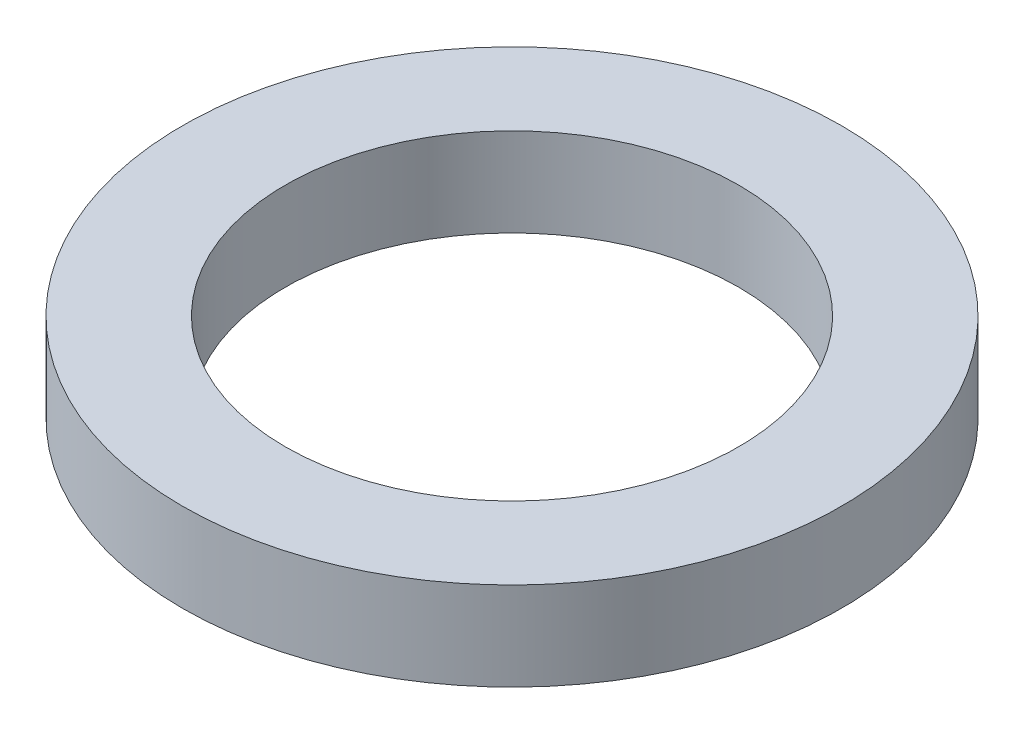
ISO-10303-21;
HEADER;
FILE_DESCRIPTION(('STEP AP214'),'2;1');
FILE_NAME('part.step','',(''),(''),'','','');
FILE_SCHEMA(('AUTOMOTIVE_DESIGN { 1 0 10303 214 1 1 1 1 }'));
ENDSEC;
DATA;
#1=APPLICATION_CONTEXT('core data for automotive mechanical design processes');
#2=APPLICATION_PROTOCOL_DEFINITION('international standard','automotive_design',2000,#1);
#3=PRODUCT_CONTEXT('',#1,'mechanical');
#4=PRODUCT('Part','Part','',(#3));
#5=PRODUCT_RELATED_PRODUCT_CATEGORY('part','',(#4));
#6=PRODUCT_DEFINITION_FORMATION('','',#4);
#7=PRODUCT_DEFINITION_CONTEXT('part definition',#1,'design');
#8=PRODUCT_DEFINITION('design','',#6,#7);
#9=PRODUCT_DEFINITION_SHAPE('','',#8);
#10=(LENGTH_UNIT() NAMED_UNIT(*) SI_UNIT(.MILLI.,.METRE.));
#11=(NAMED_UNIT(*) PLANE_ANGLE_UNIT() SI_UNIT($,.RADIAN.));
#12=(NAMED_UNIT(*) SI_UNIT($,.STERADIAN.) SOLID_ANGLE_UNIT());
#13=UNCERTAINTY_MEASURE_WITH_UNIT(LENGTH_MEASURE(1.E-05),#10,'distance_accuracy_value','');
#14=(GEOMETRIC_REPRESENTATION_CONTEXT(3) GLOBAL_UNCERTAINTY_ASSIGNED_CONTEXT((#13)) GLOBAL_UNIT_ASSIGNED_CONTEXT((#10,
#11,#12)) REPRESENTATION_CONTEXT('',''));
#15=CARTESIAN_POINT('',(0.,0.,0.));
#16=DIRECTION('',(0.,0.,1.));
#17=DIRECTION('',(1.,0.,0.));
#18=AXIS2_PLACEMENT_3D('',#15,#16,#17);
#19=CARTESIAN_POINT('',(0.,2.,0.));
#20=DIRECTION('',(0.,1.,0.));
#21=DIRECTION('',(0.,0.,1.));
#22=AXIS2_PLACEMENT_3D('',#19,#20,#21);
#23=PLANE('',#22);
#24=CARTESIAN_POINT('',(0.,2.,0.));
#25=DIRECTION('',(0.,1.,0.));
#26=DIRECTION('',(0.,0.,1.));
#27=AXIS2_PLACEMENT_3D('',#24,#25,#26);
#28=CIRCLE('',#27,7.45);
#29=CARTESIAN_POINT('',(0.,2.,7.45));
#30=VERTEX_POINT('',#29);
#31=EDGE_CURVE('E10',#30,#30,#28,.T.);
#32=ORIENTED_EDGE('',*,*,#31,.T.);
#33=EDGE_LOOP('',(#32));
#34=FACE_BOUND('',#33,.T.);
#35=CARTESIAN_POINT('',(0.,2.,0.));
#36=DIRECTION('',(0.,1.,0.));
#37=DIRECTION('',(0.,0.,1.));
#38=AXIS2_PLACEMENT_3D('',#35,#36,#37);
#39=CIRCLE('',#38,5.125);
#40=CARTESIAN_POINT('',(0.,2.,5.125));
#41=VERTEX_POINT('',#40);
#42=EDGE_CURVE('E54',#41,#41,#39,.T.);
#43=ORIENTED_EDGE('',*,*,#42,.F.);
#44=EDGE_LOOP('',(#43));
#45=FACE_BOUND('',#44,.T.);
#46=ADVANCED_FACE('F41',(#34,#45),#23,.T.);
#47=CARTESIAN_POINT('',(0.,0.,0.));
#48=DIRECTION('',(0.,1.,0.));
#49=DIRECTION('',(0.,0.,1.));
#50=AXIS2_PLACEMENT_3D('',#47,#48,#49);
#51=PLANE('',#50);
#52=CARTESIAN_POINT('',(0.,0.,0.));
#53=DIRECTION('',(0.,1.,0.));
#54=DIRECTION('',(0.,0.,1.));
#55=AXIS2_PLACEMENT_3D('',#52,#53,#54);
#56=CIRCLE('',#55,7.45);
#57=CARTESIAN_POINT('',(0.,0.,7.45));
#58=VERTEX_POINT('',#57);
#59=EDGE_CURVE('E45',#58,#58,#56,.T.);
#60=ORIENTED_EDGE('',*,*,#59,.F.);
#61=EDGE_LOOP('',(#60));
#62=FACE_BOUND('',#61,.T.);
#63=CARTESIAN_POINT('',(0.,0.,0.));
#64=DIRECTION('',(0.,1.,0.));
#65=DIRECTION('',(0.,0.,1.));
#66=AXIS2_PLACEMENT_3D('',#63,#64,#65);
#67=CIRCLE('',#66,5.125);
#68=CARTESIAN_POINT('',(0.,0.,5.125));
#69=VERTEX_POINT('',#68);
#70=EDGE_CURVE('E56',#69,#69,#67,.T.);
#71=ORIENTED_EDGE('',*,*,#70,.T.);
#72=EDGE_LOOP('',(#71));
#73=FACE_BOUND('',#72,.T.);
#74=ADVANCED_FACE('F68',(#62,#73),#51,.F.);
#75=CARTESIAN_POINT('',(0.,2.,0.));
#76=DIRECTION('',(0.,-1.,0.));
#77=DIRECTION('',(0.,0.,-1.));
#78=AXIS2_PLACEMENT_3D('',#75,#76,#77);
#79=CYLINDRICAL_SURFACE('',#78,7.45);
#80=ORIENTED_EDGE('',*,*,#31,.F.);
#81=EDGE_LOOP('',(#80));
#82=FACE_BOUND('',#81,.T.);
#83=ORIENTED_EDGE('',*,*,#59,.T.);
#84=EDGE_LOOP('',(#83));
#85=FACE_BOUND('',#84,.T.);
#86=ADVANCED_FACE('F43',(#82,#85),#79,.T.);
#87=CARTESIAN_POINT('',(0.,2.,0.));
#88=DIRECTION('',(0.,-1.,0.));
#89=DIRECTION('',(0.,0.,-1.));
#90=AXIS2_PLACEMENT_3D('',#87,#88,#89);
#91=CYLINDRICAL_SURFACE('',#90,5.125);
#92=ORIENTED_EDGE('',*,*,#42,.T.);
#93=EDGE_LOOP('',(#92));
#94=FACE_BOUND('',#93,.T.);
#95=ORIENTED_EDGE('',*,*,#70,.F.);
#96=EDGE_LOOP('',(#95));
#97=FACE_BOUND('',#96,.T.);
#98=ADVANCED_FACE('F64',(#94,#97),#91,.F.);
#99=CLOSED_SHELL('',(#46,#74,#86,#98));
#100=MANIFOLD_SOLID_BREP('B2',#99);
#101=ADVANCED_BREP_SHAPE_REPRESENTATION('',(#18,#100),#14);
#102=SHAPE_DEFINITION_REPRESENTATION(#9,#101);
ENDSEC;
END-ISO-10303-21;
